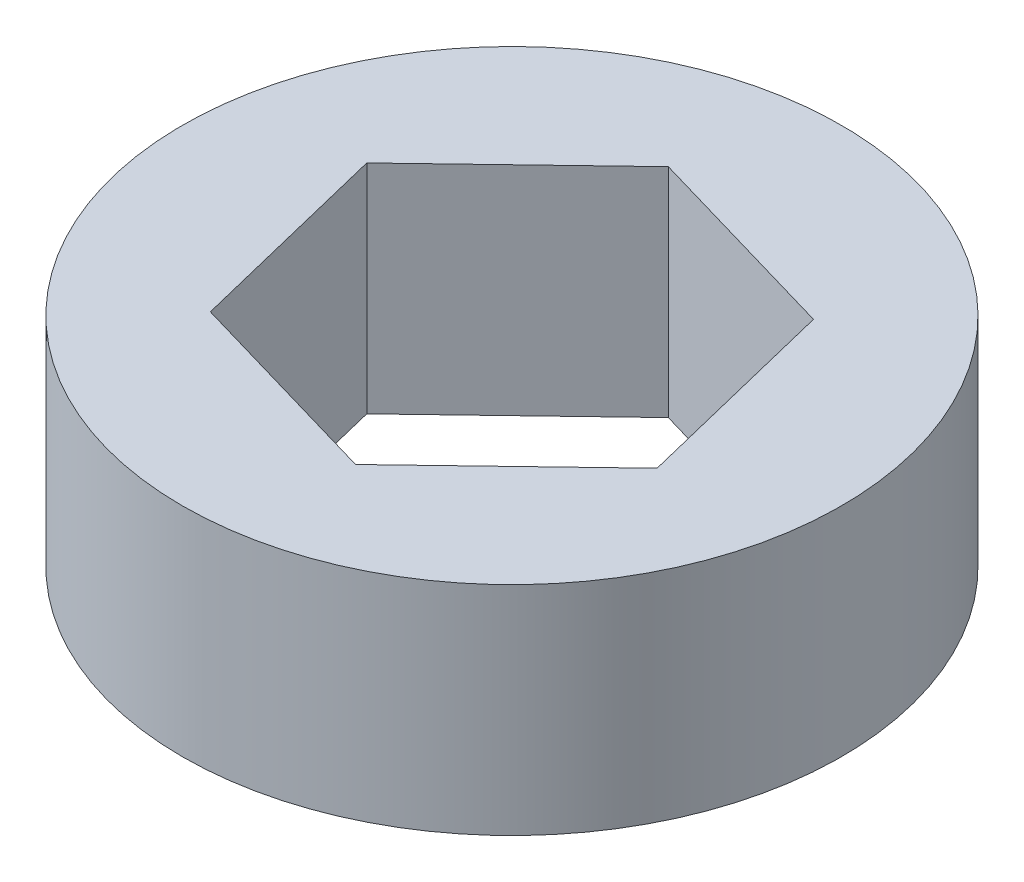
ISO-10303-21;
HEADER;
FILE_DESCRIPTION(('STEP AP214'),'2;1');
FILE_NAME('part.step','',(''),(''),'','','');
FILE_SCHEMA(('AUTOMOTIVE_DESIGN { 1 0 10303 214 1 1 1 1 }'));
ENDSEC;
DATA;
#1=APPLICATION_CONTEXT('core data for automotive mechanical design processes');
#2=APPLICATION_PROTOCOL_DEFINITION('international standard','automotive_design',2000,#1);
#3=PRODUCT_CONTEXT('',#1,'mechanical');
#4=PRODUCT('Part','Part','',(#3));
#5=PRODUCT_RELATED_PRODUCT_CATEGORY('part','',(#4));
#6=PRODUCT_DEFINITION_FORMATION('','',#4);
#7=PRODUCT_DEFINITION_CONTEXT('part definition',#1,'design');
#8=PRODUCT_DEFINITION('design','',#6,#7);
#9=PRODUCT_DEFINITION_SHAPE('','',#8);
#10=(LENGTH_UNIT() NAMED_UNIT(*) SI_UNIT(.MILLI.,.METRE.));
#11=(NAMED_UNIT(*) PLANE_ANGLE_UNIT() SI_UNIT($,.RADIAN.));
#12=(NAMED_UNIT(*) SI_UNIT($,.STERADIAN.) SOLID_ANGLE_UNIT());
#13=UNCERTAINTY_MEASURE_WITH_UNIT(LENGTH_MEASURE(1.E-05),#10,'distance_accuracy_value','');
#14=(GEOMETRIC_REPRESENTATION_CONTEXT(3) GLOBAL_UNCERTAINTY_ASSIGNED_CONTEXT((#13)) GLOBAL_UNIT_ASSIGNED_CONTEXT((#10,
#11,#12)) REPRESENTATION_CONTEXT('',''));
#15=CARTESIAN_POINT('',(0.,0.,0.));
#16=DIRECTION('',(0.,0.,1.));
#17=DIRECTION('',(1.,0.,0.));
#18=AXIS2_PLACEMENT_3D('',#15,#16,#17);
#19=CARTESIAN_POINT('',(0.,3.,0.));
#20=DIRECTION('',(0.,-1.,0.));
#21=DIRECTION('',(0.,0.,-1.));
#22=AXIS2_PLACEMENT_3D('',#19,#20,#21);
#23=CYLINDRICAL_SURFACE('',#22,4.55);
#24=CARTESIAN_POINT('',(0.,3.,0.));
#25=DIRECTION('',(0.,1.,0.));
#26=DIRECTION('',(0.,0.,1.));
#27=AXIS2_PLACEMENT_3D('',#24,#25,#26);
#28=CIRCLE('',#27,4.55);
#29=CARTESIAN_POINT('',(0.,3.,4.55));
#30=VERTEX_POINT('',#29);
#31=EDGE_CURVE('E125',#30,#30,#28,.T.);
#32=ORIENTED_EDGE('',*,*,#31,.F.);
#33=EDGE_LOOP('',(#32));
#34=FACE_BOUND('',#33,.T.);
#35=CARTESIAN_POINT('',(0.,0.,0.));
#36=DIRECTION('',(0.,1.,0.));
#37=DIRECTION('',(0.,0.,1.));
#38=AXIS2_PLACEMENT_3D('',#35,#36,#37);
#39=CIRCLE('',#38,4.55);
#40=CARTESIAN_POINT('',(0.,0.,4.55));
#41=VERTEX_POINT('',#40);
#42=EDGE_CURVE('E118',#41,#41,#39,.T.);
#43=ORIENTED_EDGE('',*,*,#42,.T.);
#44=EDGE_LOOP('',(#43));
#45=FACE_BOUND('',#44,.T.);
#46=ADVANCED_FACE('F33',(#34,#45),#23,.T.);
#47=CARTESIAN_POINT('',(0.,3.,0.));
#48=DIRECTION('',(0.,1.,0.));
#49=DIRECTION('',(0.,0.,1.));
#50=AXIS2_PLACEMENT_3D('',#47,#48,#49);
#51=PLANE('',#50);
#52=DIRECTION('',(0.237991419769063,0.,0.971267256792025));
#53=VECTOR('',#52,1.);
#54=CARTESIAN_POINT('',(-2.82711275100431,3.,-0.82306348060695));
#55=LINE('',#54,#53);
#56=CARTESIAN_POINT('',(-2.82711275100431,3.,-0.82306348060695));
#57=VERTEX_POINT('',#56);
#58=CARTESIAN_POINT('',(-2.12635025863502,3.,2.03681972142917));
#59=VERTEX_POINT('',#58);
#60=EDGE_CURVE('E47',#57,#59,#55,.T.);
#61=ORIENTED_EDGE('',*,*,#60,.F.);
#62=DIRECTION('',(-0.722146408361386,0.,0.691740243798747));
#63=VECTOR('',#62,1.);
#64=CARTESIAN_POINT('',(-0.700762492369296,3.,-2.85988320203612));
#65=LINE('',#64,#63);
#66=CARTESIAN_POINT('',(-0.700762492369296,3.,-2.85988320203612));
#67=VERTEX_POINT('',#66);
#68=EDGE_CURVE('E113',#67,#57,#65,.T.);
#69=ORIENTED_EDGE('',*,*,#68,.F.);
#70=DIRECTION('',(-0.960137828130449,0.,-0.279527012993278));
#71=VECTOR('',#70,1.);
#72=CARTESIAN_POINT('',(2.12635025863501,3.,-2.03681972142917));
#73=LINE('',#72,#71);
#74=CARTESIAN_POINT('',(2.12635025863501,3.,-2.03681972142917));
#75=VERTEX_POINT('',#74);
#76=EDGE_CURVE('E107',#75,#67,#73,.T.);
#77=ORIENTED_EDGE('',*,*,#76,.F.);
#78=DIRECTION('',(-0.237991419769063,0.,-0.971267256792025));
#79=VECTOR('',#78,1.);
#80=CARTESIAN_POINT('',(2.82711275100431,3.,0.823063480606951));
#81=LINE('',#80,#79);
#82=CARTESIAN_POINT('',(2.82711275100431,3.,0.823063480606951));
#83=VERTEX_POINT('',#82);
#84=EDGE_CURVE('E105',#83,#75,#81,.T.);
#85=ORIENTED_EDGE('',*,*,#84,.F.);
#86=DIRECTION('',(0.722146408361386,0.,-0.691740243798747));
#87=VECTOR('',#86,1.);
#88=CARTESIAN_POINT('',(0.700762492369297,3.,2.85988320203612));
#89=LINE('',#88,#87);
#90=CARTESIAN_POINT('',(0.700762492369297,3.,2.85988320203612));
#91=VERTEX_POINT('',#90);
#92=EDGE_CURVE('E88',#91,#83,#89,.T.);
#93=ORIENTED_EDGE('',*,*,#92,.F.);
#94=DIRECTION('',(0.960137828130449,0.,0.279527012993278));
#95=VECTOR('',#94,1.);
#96=CARTESIAN_POINT('',(-2.12635025863502,3.,2.03681972142917));
#97=LINE('',#96,#95);
#98=EDGE_CURVE('E97',#59,#91,#97,.T.);
#99=ORIENTED_EDGE('',*,*,#98,.F.);
#100=EDGE_LOOP('',(#61,#69,#77,#85,#93,#99));
#101=FACE_BOUND('',#100,.T.);
#102=ORIENTED_EDGE('',*,*,#31,.T.);
#103=EDGE_LOOP('',(#102));
#104=FACE_BOUND('',#103,.T.);
#105=ADVANCED_FACE('F101',(#101,#104),#51,.T.);
#106=CARTESIAN_POINT('',(0.,0.,0.));
#107=DIRECTION('',(0.,1.,0.));
#108=DIRECTION('',(0.,0.,1.));
#109=AXIS2_PLACEMENT_3D('',#106,#107,#108);
#110=PLANE('',#109);
#111=DIRECTION('',(-0.722146408361387,0.,0.691740243798747));
#112=VECTOR('',#111,1.);
#113=CARTESIAN_POINT('',(-1.7639376216868,0.,-1.84147334132154));
#114=LINE('',#113,#112);
#115=CARTESIAN_POINT('',(-0.700762492369296,0.,-2.85988320203612));
#116=VERTEX_POINT('',#115);
#117=CARTESIAN_POINT('',(-2.82711275100431,0.,-0.82306348060695));
#118=VERTEX_POINT('',#117);
#119=EDGE_CURVE('E40',#116,#118,#114,.T.);
#120=ORIENTED_EDGE('',*,*,#119,.T.);
#121=DIRECTION('',(0.237991419769063,0.,0.971267256792025));
#122=VECTOR('',#121,1.);
#123=CARTESIAN_POINT('',(-2.47673150481966,0.,0.60687812041111));
#124=LINE('',#123,#122);
#125=CARTESIAN_POINT('',(-2.12635025863502,0.,2.03681972142917));
#126=VERTEX_POINT('',#125);
#127=EDGE_CURVE('E11',#118,#126,#124,.T.);
#128=ORIENTED_EDGE('',*,*,#127,.T.);
#129=DIRECTION('',(0.960137828130449,0.,0.279527012993278));
#130=VECTOR('',#129,1.);
#131=CARTESIAN_POINT('',(-0.71279388313286,0.,2.44835146173264));
#132=LINE('',#131,#130);
#133=CARTESIAN_POINT('',(0.700762492369297,0.,2.85988320203612));
#134=VERTEX_POINT('',#133);
#135=EDGE_CURVE('E128',#126,#134,#132,.T.);
#136=ORIENTED_EDGE('',*,*,#135,.T.);
#137=DIRECTION('',(0.722146408361386,0.,-0.691740243798747));
#138=VECTOR('',#137,1.);
#139=CARTESIAN_POINT('',(1.7639376216868,0.,1.84147334132154));
#140=LINE('',#139,#138);
#141=CARTESIAN_POINT('',(2.82711275100431,0.,0.823063480606951));
#142=VERTEX_POINT('',#141);
#143=EDGE_CURVE('E91',#134,#142,#140,.T.);
#144=ORIENTED_EDGE('',*,*,#143,.T.);
#145=DIRECTION('',(-0.237991419769063,0.,-0.971267256792025));
#146=VECTOR('',#145,1.);
#147=CARTESIAN_POINT('',(2.47673150481966,0.,-0.60687812041111));
#148=LINE('',#147,#146);
#149=CARTESIAN_POINT('',(2.12635025863501,0.,-2.03681972142917));
#150=VERTEX_POINT('',#149);
#151=EDGE_CURVE('E133',#142,#150,#148,.T.);
#152=ORIENTED_EDGE('',*,*,#151,.T.);
#153=DIRECTION('',(-0.960137828130449,0.,-0.279527012993278));
#154=VECTOR('',#153,1.);
#155=CARTESIAN_POINT('',(0.71279388313286,0.,-2.44835146173264));
#156=LINE('',#155,#154);
#157=EDGE_CURVE('E136',#150,#116,#156,.T.);
#158=ORIENTED_EDGE('',*,*,#157,.T.);
#159=EDGE_LOOP('',(#120,#128,#136,#144,#152,#158));
#160=FACE_BOUND('',#159,.T.);
#161=ORIENTED_EDGE('',*,*,#42,.F.);
#162=EDGE_LOOP('',(#161));
#163=FACE_BOUND('',#162,.T.);
#164=ADVANCED_FACE('F140',(#160,#163),#110,.F.);
#165=CARTESIAN_POINT('',(-2.82711275100431,-12.,-0.82306348060695));
#166=DIRECTION('',(-0.971267256792025,0.,0.237991419769063));
#167=DIRECTION('',(0.237991419769063,0.,0.971267256792025));
#168=AXIS2_PLACEMENT_3D('',#165,#166,#167);
#169=PLANE('',#168);
#170=DIRECTION('',(0.,1.,0.));
#171=VECTOR('',#170,1.);
#172=CARTESIAN_POINT('',(-2.82711275100431,-12.,-0.82306348060695));
#173=LINE('',#172,#171);
#174=EDGE_CURVE('E116',#118,#57,#173,.T.);
#175=ORIENTED_EDGE('',*,*,#174,.T.);
#176=ORIENTED_EDGE('',*,*,#60,.T.);
#177=DIRECTION('',(0.,1.,0.));
#178=VECTOR('',#177,1.);
#179=CARTESIAN_POINT('',(-2.12635025863502,-12.,2.03681972142917));
#180=LINE('',#179,#178);
#181=EDGE_CURVE('E94',#126,#59,#180,.T.);
#182=ORIENTED_EDGE('',*,*,#181,.F.);
#183=ORIENTED_EDGE('',*,*,#127,.F.);
#184=EDGE_LOOP('',(#175,#176,#182,#183));
#185=FACE_BOUND('',#184,.T.);
#186=ADVANCED_FACE('F152',(#185),#169,.F.);
#187=CARTESIAN_POINT('',(-0.700762492369296,-12.,-2.85988320203612));
#188=DIRECTION('',(-0.691740243798747,0.,-0.722146408361387));
#189=DIRECTION('',(-0.722146408361387,0.,0.691740243798747));
#190=AXIS2_PLACEMENT_3D('',#187,#188,#189);
#191=PLANE('',#190);
#192=DIRECTION('',(0.,1.,0.));
#193=VECTOR('',#192,1.);
#194=CARTESIAN_POINT('',(-0.700762492369296,-12.,-2.85988320203612));
#195=LINE('',#194,#193);
#196=EDGE_CURVE('E119',#116,#67,#195,.T.);
#197=ORIENTED_EDGE('',*,*,#196,.T.);
#198=ORIENTED_EDGE('',*,*,#68,.T.);
#199=ORIENTED_EDGE('',*,*,#174,.F.);
#200=ORIENTED_EDGE('',*,*,#119,.F.);
#201=EDGE_LOOP('',(#197,#198,#199,#200));
#202=FACE_BOUND('',#201,.T.);
#203=ADVANCED_FACE('F145',(#202),#191,.F.);
#204=CARTESIAN_POINT('',(2.12635025863501,-12.,-2.03681972142917));
#205=DIRECTION('',(0.279527012993278,0.,-0.960137828130449));
#206=DIRECTION('',(-0.960137828130449,0.,-0.279527012993278));
#207=AXIS2_PLACEMENT_3D('',#204,#205,#206);
#208=PLANE('',#207);
#209=DIRECTION('',(0.,1.,0.));
#210=VECTOR('',#209,1.);
#211=CARTESIAN_POINT('',(2.12635025863501,-12.,-2.03681972142917));
#212=LINE('',#211,#210);
#213=EDGE_CURVE('E121',#150,#75,#212,.T.);
#214=ORIENTED_EDGE('',*,*,#213,.T.);
#215=ORIENTED_EDGE('',*,*,#76,.T.);
#216=ORIENTED_EDGE('',*,*,#196,.F.);
#217=ORIENTED_EDGE('',*,*,#157,.F.);
#218=EDGE_LOOP('',(#214,#215,#216,#217));
#219=FACE_BOUND('',#218,.T.);
#220=ADVANCED_FACE('F147',(#219),#208,.F.);
#221=CARTESIAN_POINT('',(2.82711275100431,-12.,0.823063480606951));
#222=DIRECTION('',(0.971267256792025,0.,-0.237991419769063));
#223=DIRECTION('',(-0.237991419769063,0.,-0.971267256792025));
#224=AXIS2_PLACEMENT_3D('',#221,#222,#223);
#225=PLANE('',#224);
#226=DIRECTION('',(0.,1.,0.));
#227=VECTOR('',#226,1.);
#228=CARTESIAN_POINT('',(2.82711275100431,-12.,0.823063480606951));
#229=LINE('',#228,#227);
#230=EDGE_CURVE('E93',#142,#83,#229,.T.);
#231=ORIENTED_EDGE('',*,*,#230,.T.);
#232=ORIENTED_EDGE('',*,*,#84,.T.);
#233=ORIENTED_EDGE('',*,*,#213,.F.);
#234=ORIENTED_EDGE('',*,*,#151,.F.);
#235=EDGE_LOOP('',(#231,#232,#233,#234));
#236=FACE_BOUND('',#235,.T.);
#237=ADVANCED_FACE('F151',(#236),#225,.F.);
#238=CARTESIAN_POINT('',(0.700762492369297,-12.,2.85988320203612));
#239=DIRECTION('',(0.691740243798747,0.,0.722146408361386));
#240=DIRECTION('',(0.722146408361386,0.,-0.691740243798747));
#241=AXIS2_PLACEMENT_3D('',#238,#239,#240);
#242=PLANE('',#241);
#243=DIRECTION('',(0.,1.,0.));
#244=VECTOR('',#243,1.);
#245=CARTESIAN_POINT('',(0.700762492369297,-12.,2.85988320203612));
#246=LINE('',#245,#244);
#247=EDGE_CURVE('E55',#134,#91,#246,.T.);
#248=ORIENTED_EDGE('',*,*,#247,.T.);
#249=ORIENTED_EDGE('',*,*,#92,.T.);
#250=ORIENTED_EDGE('',*,*,#230,.F.);
#251=ORIENTED_EDGE('',*,*,#143,.F.);
#252=EDGE_LOOP('',(#248,#249,#250,#251));
#253=FACE_BOUND('',#252,.T.);
#254=ADVANCED_FACE('F85',(#253),#242,.F.);
#255=CARTESIAN_POINT('',(-2.12635025863502,-12.,2.03681972142917));
#256=DIRECTION('',(-0.279527012993278,0.,0.960137828130449));
#257=DIRECTION('',(0.960137828130449,0.,0.279527012993278));
#258=AXIS2_PLACEMENT_3D('',#255,#256,#257);
#259=PLANE('',#258);
#260=ORIENTED_EDGE('',*,*,#181,.T.);
#261=ORIENTED_EDGE('',*,*,#98,.T.);
#262=ORIENTED_EDGE('',*,*,#247,.F.);
#263=ORIENTED_EDGE('',*,*,#135,.F.);
#264=EDGE_LOOP('',(#260,#261,#262,#263));
#265=FACE_BOUND('',#264,.T.);
#266=ADVANCED_FACE('F98',(#265),#259,.F.);
#267=CLOSED_SHELL('',(#46,#105,#164,#186,#203,#220,#237,#254,#266));
#268=MANIFOLD_SOLID_BREP('B2',#267);
#269=ADVANCED_BREP_SHAPE_REPRESENTATION('',(#18,#268),#14);
#270=SHAPE_DEFINITION_REPRESENTATION(#9,#269);
ENDSEC;
END-ISO-10303-21;
